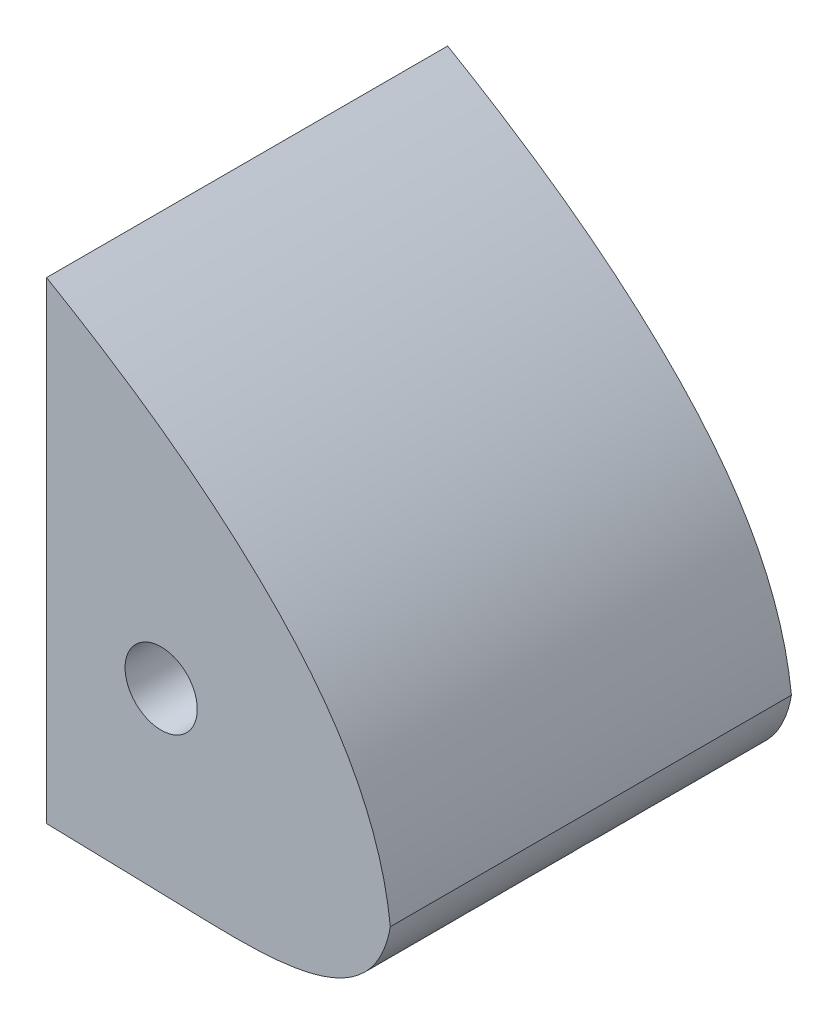
ISO-10303-21;
HEADER;
FILE_DESCRIPTION(('STEP AP214'),'2;1');
FILE_NAME('part.step','',(''),(''),'','','');
FILE_SCHEMA(('AUTOMOTIVE_DESIGN { 1 0 10303 214 1 1 1 1 }'));
ENDSEC;
DATA;
#1=APPLICATION_CONTEXT('core data for automotive mechanical design processes');
#2=APPLICATION_PROTOCOL_DEFINITION('international standard','automotive_design',2000,#1);
#3=PRODUCT_CONTEXT('',#1,'mechanical');
#4=PRODUCT('Part','Part','',(#3));
#5=PRODUCT_RELATED_PRODUCT_CATEGORY('part','',(#4));
#6=PRODUCT_DEFINITION_FORMATION('','',#4);
#7=PRODUCT_DEFINITION_CONTEXT('part definition',#1,'design');
#8=PRODUCT_DEFINITION('design','',#6,#7);
#9=PRODUCT_DEFINITION_SHAPE('','',#8);
#10=(LENGTH_UNIT() NAMED_UNIT(*) SI_UNIT(.MILLI.,.METRE.));
#11=(NAMED_UNIT(*) PLANE_ANGLE_UNIT() SI_UNIT($,.RADIAN.));
#12=(NAMED_UNIT(*) SI_UNIT($,.STERADIAN.) SOLID_ANGLE_UNIT());
#13=UNCERTAINTY_MEASURE_WITH_UNIT(LENGTH_MEASURE(1.E-05),#10,'distance_accuracy_value','');
#14=(GEOMETRIC_REPRESENTATION_CONTEXT(3) GLOBAL_UNCERTAINTY_ASSIGNED_CONTEXT((#13)) GLOBAL_UNIT_ASSIGNED_CONTEXT((#10,
#11,#12)) REPRESENTATION_CONTEXT('',''));
#15=CARTESIAN_POINT('',(0.,0.,0.));
#16=DIRECTION('',(0.,0.,1.));
#17=DIRECTION('',(1.,0.,0.));
#18=AXIS2_PLACEMENT_3D('',#15,#16,#17);
#19=CARTESIAN_POINT('',(6.23690674710794,-9.83282120050406,22.225));
#20=DIRECTION('',(0.,0.,1.));
#21=DIRECTION('',(1.,0.,0.));
#22=AXIS2_PLACEMENT_3D('',#19,#20,#21);
#23=PLANE('',#22);
#24=DIRECTION('',(0.,1.,0.));
#25=VECTOR('',#24,1.);
#26=CARTESIAN_POINT('',(57.1669962626333,30.6925003680842,22.225));
#27=LINE('',#26,#25);
#28=CARTESIAN_POINT('',(57.1669962626333,-16.8860620664663,22.225));
#29=VERTEX_POINT('',#28);
#30=CARTESIAN_POINT('',(57.1669962626792,9.31710177497897,22.225));
#31=VERTEX_POINT('',#30);
#32=EDGE_CURVE('E56',#29,#31,#27,.T.);
#33=ORIENTED_EDGE('',*,*,#32,.F.);
#34=CARTESIAN_POINT('',(-66.0069716290182,-5.63470862311853,22.225));
#35=CARTESIAN_POINT('',(-44.5940371879974,-5.53917687984261,22.225));
#36=CARTESIAN_POINT('',(-13.0130223079607,-6.7240985019302,22.225));
#37=CARTESIAN_POINT('',(26.1366565690305,-12.7508567541693,22.225));
#38=CARTESIAN_POINT('',(48.7652674229662,-16.9007642038901,22.225));
#39=CARTESIAN_POINT('',(64.6833626627234,-16.9690523934928,22.225));
#40=CARTESIAN_POINT('',(75.2906304926915,-17.5225292184952,22.225));
#41=CARTESIAN_POINT('',(76.2169962626333,-12.3082935907539,22.225));
#42=B_SPLINE_CURVE_WITH_KNOTS('',3,(#34,#35,#36,#37,#38,#39,#40,#41),.UNSPECIFIED.,.F.,.F.,(4,1,
1,1,1,4),(0.133250971952972,0.517329721776624,0.696666541434988,0.84940993817877,
0.919519723249622,1.),.UNSPECIFIED.);
#43=CARTESIAN_POINT('',(76.2169962626333,-12.3082935907539,22.225));
#44=VERTEX_POINT('',#43);
#45=EDGE_CURVE('E63',#29,#44,#42,.T.);
#46=ORIENTED_EDGE('',*,*,#45,.T.);
#47=CARTESIAN_POINT('',(76.2169962626333,-12.3082935907539,22.225));
#48=CARTESIAN_POINT('',(75.6069525390447,-6.76655965764841,22.225));
#49=CARTESIAN_POINT('',(69.7043006889504,1.13838920453428,22.225));
#50=CARTESIAN_POINT('',(56.4222366314094,10.2643835983855,22.225));
#51=CARTESIAN_POINT('',(36.9761031047391,19.3707728361886,22.225));
#52=CARTESIAN_POINT('',(8.74168720896823,24.8154039567916,22.225));
#53=CARTESIAN_POINT('',(-27.455234983126,23.566672909106,22.225));
#54=CARTESIAN_POINT('',(-52.387628687855,18.1036316509052,22.225));
#55=CARTESIAN_POINT('',(-66.0069716290183,14.9523239686121,22.225));
#56=B_SPLINE_CURVE_WITH_KNOTS('',3,(#47,#48,#49,#50,#51,#52,#53,#54,#55),.UNSPECIFIED.,.F.,.F.,
(4,1,1,1,1,1,4),(0.,0.0865869930935198,0.16173742787457,0.268322265449627,0.445156626621206,
0.638028872876503,0.87237087622276),.UNSPECIFIED.);
#57=EDGE_CURVE('E84',#44,#31,#56,.T.);
#58=ORIENTED_EDGE('',*,*,#57,.T.);
#59=EDGE_LOOP('',(#33,#46,#58));
#60=FACE_BOUND('',#59,.T.);
#61=CARTESIAN_POINT('',(63.5169962626333,-7.2282935907539,22.225));
#62=DIRECTION('',(0.,0.,1.));
#63=DIRECTION('',(1.,0.,0.));
#64=AXIS2_PLACEMENT_3D('',#61,#62,#63);
#65=CIRCLE('',#64,2.);
#66=CARTESIAN_POINT('',(65.5169962626333,-7.2282935907539,22.225));
#67=VERTEX_POINT('',#66);
#68=EDGE_CURVE('E169',#67,#67,#65,.T.);
#69=ORIENTED_EDGE('',*,*,#68,.F.);
#70=EDGE_LOOP('',(#69));
#71=FACE_BOUND('',#70,.T.);
#72=ADVANCED_FACE('F39',(#60,#71),#23,.T.);
#73=CARTESIAN_POINT('',(6.23690674710794,-9.83282120050406,0.));
#74=DIRECTION('',(0.,0.,1.));
#75=DIRECTION('',(1.,0.,0.));
#76=AXIS2_PLACEMENT_3D('',#73,#74,#75);
#77=PLANE('',#76);
#78=CARTESIAN_POINT('',(-66.0069716290182,-5.63470862311853,0.));
#79=CARTESIAN_POINT('',(-44.5940371879974,-5.53917687984261,0.));
#80=CARTESIAN_POINT('',(-13.0130223079607,-6.7240985019302,0.));
#81=CARTESIAN_POINT('',(26.1366565690305,-12.7508567541693,0.));
#82=CARTESIAN_POINT('',(48.7652674229662,-16.9007642038901,0.));
#83=CARTESIAN_POINT('',(64.6833626627234,-16.9690523934928,0.));
#84=CARTESIAN_POINT('',(75.2906304926915,-17.5225292184952,0.));
#85=CARTESIAN_POINT('',(76.2169962626333,-12.3082935907539,0.));
#86=B_SPLINE_CURVE_WITH_KNOTS('',3,(#78,#79,#80,#81,#82,#83,#84,#85),.UNSPECIFIED.,.F.,.F.,(4,1,
1,1,1,4),(0.133250971952972,0.517329721776624,0.696666541434988,0.84940993817877,
0.919519723249622,1.),.UNSPECIFIED.);
#87=CARTESIAN_POINT('',(57.1669962626333,-16.8860620664663,0.));
#88=VERTEX_POINT('',#87);
#89=CARTESIAN_POINT('',(76.2169962626333,-12.3082935907539,0.));
#90=VERTEX_POINT('',#89);
#91=EDGE_CURVE('E95',#88,#90,#86,.T.);
#92=ORIENTED_EDGE('',*,*,#91,.F.);
#93=DIRECTION('',(0.,1.,0.));
#94=VECTOR('',#93,1.);
#95=CARTESIAN_POINT('',(57.1669962626333,-9.83282120050406,0.));
#96=LINE('',#95,#94);
#97=CARTESIAN_POINT('',(57.1669962626333,9.31710177500563,0.));
#98=VERTEX_POINT('',#97);
#99=EDGE_CURVE('E77',#88,#98,#96,.T.);
#100=ORIENTED_EDGE('',*,*,#99,.T.);
#101=CARTESIAN_POINT('',(76.2169962626333,-12.3082935907539,0.));
#102=CARTESIAN_POINT('',(75.6069525390447,-6.76655965764841,0.));
#103=CARTESIAN_POINT('',(69.7043006889504,1.13838920453428,0.));
#104=CARTESIAN_POINT('',(56.4222366314094,10.2643835983855,0.));
#105=CARTESIAN_POINT('',(36.9761031047391,19.3707728361886,0.));
#106=CARTESIAN_POINT('',(8.74168720896823,24.8154039567916,0.));
#107=CARTESIAN_POINT('',(-27.455234983126,23.566672909106,0.));
#108=CARTESIAN_POINT('',(-52.387628687855,18.1036316509052,0.));
#109=CARTESIAN_POINT('',(-66.0069716290183,14.9523239686121,0.));
#110=B_SPLINE_CURVE_WITH_KNOTS('',3,(#101,#102,#103,#104,#105,#106,#107,#108,#109),
.UNSPECIFIED.,.F.,.F.,(4,1,1,1,1,1,4),(0.,0.0865869930935198,0.16173742787457,0.268322265449627,
0.445156626621206,0.638028872876503,0.87237087622276),.UNSPECIFIED.);
#111=EDGE_CURVE('E90',#90,#98,#110,.T.);
#112=ORIENTED_EDGE('',*,*,#111,.F.);
#113=EDGE_LOOP('',(#92,#100,#112));
#114=FACE_BOUND('',#113,.T.);
#115=CARTESIAN_POINT('',(63.5169962626333,-7.2282935907539,0.));
#116=DIRECTION('',(0.,0.,1.));
#117=DIRECTION('',(1.,0.,0.));
#118=AXIS2_PLACEMENT_3D('',#115,#116,#117);
#119=CIRCLE('',#118,2.);
#120=CARTESIAN_POINT('',(65.5169962626333,-7.2282935907539,0.));
#121=VERTEX_POINT('',#120);
#122=EDGE_CURVE('E81',#121,#121,#119,.T.);
#123=ORIENTED_EDGE('',*,*,#122,.T.);
#124=EDGE_LOOP('',(#123));
#125=FACE_BOUND('',#124,.T.);
#126=ADVANCED_FACE('F119',(#114,#125),#77,.F.);
#127=DIRECTION('',(0.,0.,-1.));
#128=VECTOR('',#127,1.);
#129=SURFACE_OF_LINEAR_EXTRUSION('',#42,#128);
#130=ORIENTED_EDGE('',*,*,#45,.F.);
#131=DIRECTION('',(0.,0.,-1.));
#132=VECTOR('',#131,1.);
#133=CARTESIAN_POINT('',(57.1669962626333,-16.8860620665246,22.225));
#134=LINE('',#133,#132);
#135=EDGE_CURVE('E74',#29,#88,#134,.T.);
#136=ORIENTED_EDGE('',*,*,#135,.T.);
#137=ORIENTED_EDGE('',*,*,#91,.T.);
#138=DIRECTION('',(0.,0.,-1.));
#139=VECTOR('',#138,1.);
#140=CARTESIAN_POINT('',(76.2169962626333,-12.3082935907539,22.225));
#141=LINE('',#140,#139);
#142=EDGE_CURVE('E49',#44,#90,#141,.T.);
#143=ORIENTED_EDGE('',*,*,#142,.F.);
#144=EDGE_LOOP('',(#130,#136,#137,#143));
#145=FACE_BOUND('',#144,.T.);
#146=ADVANCED_FACE('F41',(#145),#129,.F.);
#147=DIRECTION('',(0.,0.,-1.));
#148=VECTOR('',#147,1.);
#149=SURFACE_OF_LINEAR_EXTRUSION('',#56,#148);
#150=ORIENTED_EDGE('',*,*,#111,.T.);
#151=DIRECTION('',(0.,0.,-1.));
#152=VECTOR('',#151,1.);
#153=CARTESIAN_POINT('',(57.1669962626333,9.31710177500563,22.225));
#154=LINE('',#153,#152);
#155=EDGE_CURVE('E11',#98,#31,#154,.F.);
#156=ORIENTED_EDGE('',*,*,#155,.T.);
#157=ORIENTED_EDGE('',*,*,#57,.F.);
#158=ORIENTED_EDGE('',*,*,#142,.T.);
#159=EDGE_LOOP('',(#150,#156,#157,#158));
#160=FACE_BOUND('',#159,.T.);
#161=ADVANCED_FACE('F114',(#160),#149,.F.);
#162=CARTESIAN_POINT('',(63.5169962626333,-7.2282935907539,22.225));
#163=DIRECTION('',(0.,0.,-1.));
#164=DIRECTION('',(-1.,0.,0.));
#165=AXIS2_PLACEMENT_3D('',#162,#163,#164);
#166=CYLINDRICAL_SURFACE('',#165,2.);
#167=ORIENTED_EDGE('',*,*,#68,.T.);
#168=EDGE_LOOP('',(#167));
#169=FACE_BOUND('',#168,.T.);
#170=ORIENTED_EDGE('',*,*,#122,.F.);
#171=EDGE_LOOP('',(#170));
#172=FACE_BOUND('',#171,.T.);
#173=ADVANCED_FACE('F117',(#169,#172),#166,.F.);
#174=CARTESIAN_POINT('',(57.1669962626333,30.6925003680842,-6.731));
#175=DIRECTION('',(1.,0.,0.));
#176=DIRECTION('',(0.,0.,-1.));
#177=AXIS2_PLACEMENT_3D('',#174,#175,#176);
#178=PLANE('',#177);
#179=ORIENTED_EDGE('',*,*,#32,.T.);
#180=ORIENTED_EDGE('',*,*,#155,.F.);
#181=ORIENTED_EDGE('',*,*,#99,.F.);
#182=ORIENTED_EDGE('',*,*,#135,.F.);
#183=EDGE_LOOP('',(#179,#180,#181,#182));
#184=FACE_BOUND('',#183,.T.);
#185=ADVANCED_FACE('F75',(#184),#178,.F.);
#186=CLOSED_SHELL('',(#72,#126,#146,#161,#173,#185));
#187=MANIFOLD_SOLID_BREP('B2',#186);
#188=ADVANCED_BREP_SHAPE_REPRESENTATION('',(#18,#187),#14);
#189=SHAPE_DEFINITION_REPRESENTATION(#9,#188);
ENDSEC;
END-ISO-10303-21;
